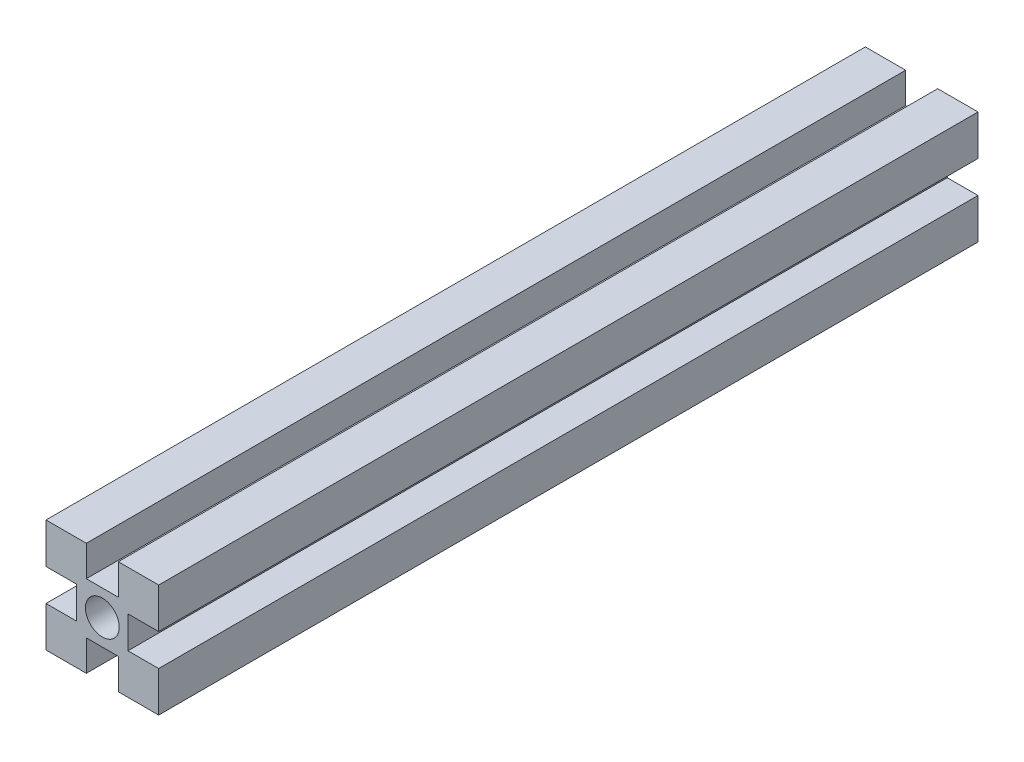
ISO-10303-21;
HEADER;
FILE_DESCRIPTION(('STEP AP214'),'2;1');
FILE_NAME('part.step','',(''),(''),'','','');
FILE_SCHEMA(('AUTOMOTIVE_DESIGN { 1 0 10303 214 1 1 1 1 }'));
ENDSEC;
DATA;
#1=APPLICATION_CONTEXT('core data for automotive mechanical design processes');
#2=APPLICATION_PROTOCOL_DEFINITION('international standard','automotive_design',2000,#1);
#3=PRODUCT_CONTEXT('',#1,'mechanical');
#4=PRODUCT('Part','Part','',(#3));
#5=PRODUCT_RELATED_PRODUCT_CATEGORY('part','',(#4));
#6=PRODUCT_DEFINITION_FORMATION('','',#4);
#7=PRODUCT_DEFINITION_CONTEXT('part definition',#1,'design');
#8=PRODUCT_DEFINITION('design','',#6,#7);
#9=PRODUCT_DEFINITION_SHAPE('','',#8);
#10=(LENGTH_UNIT() NAMED_UNIT(*) SI_UNIT(.MILLI.,.METRE.));
#11=(NAMED_UNIT(*) PLANE_ANGLE_UNIT() SI_UNIT($,.RADIAN.));
#12=(NAMED_UNIT(*) SI_UNIT($,.STERADIAN.) SOLID_ANGLE_UNIT());
#13=UNCERTAINTY_MEASURE_WITH_UNIT(LENGTH_MEASURE(1.E-05),#10,'distance_accuracy_value','');
#14=(GEOMETRIC_REPRESENTATION_CONTEXT(3) GLOBAL_UNCERTAINTY_ASSIGNED_CONTEXT((#13)) GLOBAL_UNIT_ASSIGNED_CONTEXT((#10,
#11,#12)) REPRESENTATION_CONTEXT('',''));
#15=CARTESIAN_POINT('',(0.,0.,0.));
#16=DIRECTION('',(0.,0.,1.));
#17=DIRECTION('',(1.,0.,0.));
#18=AXIS2_PLACEMENT_3D('',#15,#16,#17);
#19=CARTESIAN_POINT('',(11.,3.125,160.));
#20=DIRECTION('',(-1.,0.,0.));
#21=DIRECTION('',(0.,-1.,0.));
#22=AXIS2_PLACEMENT_3D('',#19,#20,#21);
#23=PLANE('',#22);
#24=DIRECTION('',(0.,1.,0.));
#25=VECTOR('',#24,1.);
#26=CARTESIAN_POINT('',(11.,3.125,0.));
#27=LINE('',#26,#25);
#28=CARTESIAN_POINT('',(11.,3.125,0.));
#29=VERTEX_POINT('',#28);
#30=CARTESIAN_POINT('',(11.,11.,0.));
#31=VERTEX_POINT('',#30);
#32=EDGE_CURVE('E203',#29,#31,#27,.T.);
#33=ORIENTED_EDGE('',*,*,#32,.T.);
#34=DIRECTION('',(0.,0.,-1.));
#35=VECTOR('',#34,1.);
#36=CARTESIAN_POINT('',(11.,11.,160.));
#37=LINE('',#36,#35);
#38=CARTESIAN_POINT('',(11.,11.,160.));
#39=VERTEX_POINT('',#38);
#40=EDGE_CURVE('E11',#39,#31,#37,.T.);
#41=ORIENTED_EDGE('',*,*,#40,.F.);
#42=DIRECTION('',(0.,1.,0.));
#43=VECTOR('',#42,1.);
#44=CARTESIAN_POINT('',(11.,3.125,160.));
#45=LINE('',#44,#43);
#46=CARTESIAN_POINT('',(11.,3.125,160.));
#47=VERTEX_POINT('',#46);
#48=EDGE_CURVE('E242',#47,#39,#45,.T.);
#49=ORIENTED_EDGE('',*,*,#48,.F.);
#50=DIRECTION('',(0.,0.,-1.));
#51=VECTOR('',#50,1.);
#52=CARTESIAN_POINT('',(11.,3.125,160.));
#53=LINE('',#52,#51);
#54=EDGE_CURVE('E199',#47,#29,#53,.T.);
#55=ORIENTED_EDGE('',*,*,#54,.T.);
#56=EDGE_LOOP('',(#33,#41,#49,#55));
#57=FACE_BOUND('',#56,.T.);
#58=ADVANCED_FACE('F32',(#57),#23,.F.);
#59=CARTESIAN_POINT('',(3.125,11.,160.));
#60=DIRECTION('',(0.,-1.,0.));
#61=DIRECTION('',(0.,0.,-1.));
#62=AXIS2_PLACEMENT_3D('',#59,#60,#61);
#63=PLANE('',#62);
#64=DIRECTION('',(-1.,0.,0.));
#65=VECTOR('',#64,1.);
#66=CARTESIAN_POINT('',(3.125,11.,0.));
#67=LINE('',#66,#65);
#68=CARTESIAN_POINT('',(3.125,11.,0.));
#69=VERTEX_POINT('',#68);
#70=EDGE_CURVE('E206',#31,#69,#67,.T.);
#71=ORIENTED_EDGE('',*,*,#70,.T.);
#72=DIRECTION('',(0.,0.,-1.));
#73=VECTOR('',#72,1.);
#74=CARTESIAN_POINT('',(3.125,11.,160.));
#75=LINE('',#74,#73);
#76=CARTESIAN_POINT('',(3.125,11.,160.));
#77=VERTEX_POINT('',#76);
#78=EDGE_CURVE('E40',#77,#69,#75,.T.);
#79=ORIENTED_EDGE('',*,*,#78,.F.);
#80=DIRECTION('',(-1.,0.,0.));
#81=VECTOR('',#80,1.);
#82=CARTESIAN_POINT('',(3.125,11.,160.));
#83=LINE('',#82,#81);
#84=EDGE_CURVE('E128',#39,#77,#83,.T.);
#85=ORIENTED_EDGE('',*,*,#84,.F.);
#86=ORIENTED_EDGE('',*,*,#40,.T.);
#87=EDGE_LOOP('',(#71,#79,#85,#86));
#88=FACE_BOUND('',#87,.T.);
#89=ADVANCED_FACE('F361',(#88),#63,.F.);
#90=CARTESIAN_POINT('',(3.125,11.,160.));
#91=DIRECTION('',(1.,0.,0.));
#92=DIRECTION('',(0.,1.,0.));
#93=AXIS2_PLACEMENT_3D('',#90,#91,#92);
#94=PLANE('',#93);
#95=DIRECTION('',(0.,-1.,0.));
#96=VECTOR('',#95,1.);
#97=CARTESIAN_POINT('',(3.125,11.,0.));
#98=LINE('',#97,#96);
#99=CARTESIAN_POINT('',(3.125,5.,0.));
#100=VERTEX_POINT('',#99);
#101=EDGE_CURVE('E209',#69,#100,#98,.T.);
#102=ORIENTED_EDGE('',*,*,#101,.T.);
#103=DIRECTION('',(0.,0.,-1.));
#104=VECTOR('',#103,1.);
#105=CARTESIAN_POINT('',(3.125,5.,160.));
#106=LINE('',#105,#104);
#107=CARTESIAN_POINT('',(3.125,5.,160.));
#108=VERTEX_POINT('',#107);
#109=EDGE_CURVE('E285',#108,#100,#106,.T.);
#110=ORIENTED_EDGE('',*,*,#109,.F.);
#111=DIRECTION('',(0.,-1.,0.));
#112=VECTOR('',#111,1.);
#113=CARTESIAN_POINT('',(3.125,11.,160.));
#114=LINE('',#113,#112);
#115=EDGE_CURVE('E293',#77,#108,#114,.T.);
#116=ORIENTED_EDGE('',*,*,#115,.F.);
#117=ORIENTED_EDGE('',*,*,#78,.T.);
#118=EDGE_LOOP('',(#102,#110,#116,#117));
#119=FACE_BOUND('',#118,.T.);
#120=ADVANCED_FACE('F291',(#119),#94,.F.);
#121=CARTESIAN_POINT('',(-3.125,5.,160.));
#122=DIRECTION('',(0.,-1.,0.));
#123=DIRECTION('',(0.,0.,-1.));
#124=AXIS2_PLACEMENT_3D('',#121,#122,#123);
#125=PLANE('',#124);
#126=DIRECTION('',(-1.,0.,0.));
#127=VECTOR('',#126,1.);
#128=CARTESIAN_POINT('',(-3.125,5.,0.));
#129=LINE('',#128,#127);
#130=CARTESIAN_POINT('',(-3.125,5.,0.));
#131=VERTEX_POINT('',#130);
#132=EDGE_CURVE('E211',#100,#131,#129,.T.);
#133=ORIENTED_EDGE('',*,*,#132,.T.);
#134=DIRECTION('',(0.,0.,-1.));
#135=VECTOR('',#134,1.);
#136=CARTESIAN_POINT('',(-3.125,5.,160.));
#137=LINE('',#136,#135);
#138=CARTESIAN_POINT('',(-3.125,5.,160.));
#139=VERTEX_POINT('',#138);
#140=EDGE_CURVE('E282',#139,#131,#137,.T.);
#141=ORIENTED_EDGE('',*,*,#140,.F.);
#142=DIRECTION('',(-1.,0.,0.));
#143=VECTOR('',#142,1.);
#144=CARTESIAN_POINT('',(-3.125,5.,160.));
#145=LINE('',#144,#143);
#146=EDGE_CURVE('E311',#108,#139,#145,.T.);
#147=ORIENTED_EDGE('',*,*,#146,.F.);
#148=ORIENTED_EDGE('',*,*,#109,.T.);
#149=EDGE_LOOP('',(#133,#141,#147,#148));
#150=FACE_BOUND('',#149,.T.);
#151=ADVANCED_FACE('F302',(#150),#125,.F.);
#152=CARTESIAN_POINT('',(-3.12500000000001,11.,160.));
#153=DIRECTION('',(-1.,0.,0.));
#154=DIRECTION('',(0.,-1.,0.));
#155=AXIS2_PLACEMENT_3D('',#152,#153,#154);
#156=PLANE('',#155);
#157=DIRECTION('',(0.,1.,0.));
#158=VECTOR('',#157,1.);
#159=CARTESIAN_POINT('',(-3.12500000000001,11.,0.));
#160=LINE('',#159,#158);
#161=CARTESIAN_POINT('',(-3.12500000000001,11.,0.));
#162=VERTEX_POINT('',#161);
#163=EDGE_CURVE('E213',#131,#162,#160,.T.);
#164=ORIENTED_EDGE('',*,*,#163,.T.);
#165=DIRECTION('',(0.,0.,-1.));
#166=VECTOR('',#165,1.);
#167=CARTESIAN_POINT('',(-3.12500000000001,11.,160.));
#168=LINE('',#167,#166);
#169=CARTESIAN_POINT('',(-3.12500000000001,11.,160.));
#170=VERTEX_POINT('',#169);
#171=EDGE_CURVE('E279',#170,#162,#168,.T.);
#172=ORIENTED_EDGE('',*,*,#171,.F.);
#173=DIRECTION('',(0.,1.,0.));
#174=VECTOR('',#173,1.);
#175=CARTESIAN_POINT('',(-3.12500000000001,11.,160.));
#176=LINE('',#175,#174);
#177=EDGE_CURVE('E308',#139,#170,#176,.T.);
#178=ORIENTED_EDGE('',*,*,#177,.F.);
#179=ORIENTED_EDGE('',*,*,#140,.T.);
#180=EDGE_LOOP('',(#164,#172,#178,#179));
#181=FACE_BOUND('',#180,.T.);
#182=ADVANCED_FACE('F306',(#181),#156,.F.);
#183=CARTESIAN_POINT('',(-11.,11.,160.));
#184=DIRECTION('',(0.,-1.,0.));
#185=DIRECTION('',(0.,0.,-1.));
#186=AXIS2_PLACEMENT_3D('',#183,#184,#185);
#187=PLANE('',#186);
#188=DIRECTION('',(-1.,0.,0.));
#189=VECTOR('',#188,1.);
#190=CARTESIAN_POINT('',(-11.,11.,0.));
#191=LINE('',#190,#189);
#192=CARTESIAN_POINT('',(-11.,11.,0.));
#193=VERTEX_POINT('',#192);
#194=EDGE_CURVE('E215',#162,#193,#191,.T.);
#195=ORIENTED_EDGE('',*,*,#194,.T.);
#196=DIRECTION('',(0.,0.,-1.));
#197=VECTOR('',#196,1.);
#198=CARTESIAN_POINT('',(-11.,11.,160.));
#199=LINE('',#198,#197);
#200=CARTESIAN_POINT('',(-11.,11.,160.));
#201=VERTEX_POINT('',#200);
#202=EDGE_CURVE('E276',#201,#193,#199,.T.);
#203=ORIENTED_EDGE('',*,*,#202,.F.);
#204=DIRECTION('',(-1.,0.,0.));
#205=VECTOR('',#204,1.);
#206=CARTESIAN_POINT('',(-11.,11.,160.));
#207=LINE('',#206,#205);
#208=EDGE_CURVE('E310',#170,#201,#207,.T.);
#209=ORIENTED_EDGE('',*,*,#208,.F.);
#210=ORIENTED_EDGE('',*,*,#171,.T.);
#211=EDGE_LOOP('',(#195,#203,#209,#210));
#212=FACE_BOUND('',#211,.T.);
#213=ADVANCED_FACE('F374',(#212),#187,.F.);
#214=CARTESIAN_POINT('',(-11.,3.125,160.));
#215=DIRECTION('',(1.,0.,0.));
#216=DIRECTION('',(0.,1.,0.));
#217=AXIS2_PLACEMENT_3D('',#214,#215,#216);
#218=PLANE('',#217);
#219=DIRECTION('',(0.,-1.,0.));
#220=VECTOR('',#219,1.);
#221=CARTESIAN_POINT('',(-11.,3.125,0.));
#222=LINE('',#221,#220);
#223=CARTESIAN_POINT('',(-11.,3.125,0.));
#224=VERTEX_POINT('',#223);
#225=EDGE_CURVE('E217',#193,#224,#222,.T.);
#226=ORIENTED_EDGE('',*,*,#225,.T.);
#227=DIRECTION('',(0.,0.,-1.));
#228=VECTOR('',#227,1.);
#229=CARTESIAN_POINT('',(-11.,3.125,160.));
#230=LINE('',#229,#228);
#231=CARTESIAN_POINT('',(-11.,3.125,160.));
#232=VERTEX_POINT('',#231);
#233=EDGE_CURVE('E273',#232,#224,#230,.T.);
#234=ORIENTED_EDGE('',*,*,#233,.F.);
#235=DIRECTION('',(0.,-1.,0.));
#236=VECTOR('',#235,1.);
#237=CARTESIAN_POINT('',(-11.,3.125,160.));
#238=LINE('',#237,#236);
#239=EDGE_CURVE('E313',#201,#232,#238,.T.);
#240=ORIENTED_EDGE('',*,*,#239,.F.);
#241=ORIENTED_EDGE('',*,*,#202,.T.);
#242=EDGE_LOOP('',(#226,#234,#240,#241));
#243=FACE_BOUND('',#242,.T.);
#244=ADVANCED_FACE('F377',(#243),#218,.F.);
#245=CARTESIAN_POINT('',(-11.,3.125,160.));
#246=DIRECTION('',(0.,1.,0.));
#247=DIRECTION('',(-1.,0.,0.));
#248=AXIS2_PLACEMENT_3D('',#245,#246,#247);
#249=PLANE('',#248);
#250=DIRECTION('',(1.,0.,0.));
#251=VECTOR('',#250,1.);
#252=CARTESIAN_POINT('',(-11.,3.125,0.));
#253=LINE('',#252,#251);
#254=CARTESIAN_POINT('',(-5.,3.125,0.));
#255=VERTEX_POINT('',#254);
#256=EDGE_CURVE('E219',#224,#255,#253,.T.);
#257=ORIENTED_EDGE('',*,*,#256,.T.);
#258=DIRECTION('',(0.,0.,-1.));
#259=VECTOR('',#258,1.);
#260=CARTESIAN_POINT('',(-5.,3.125,160.));
#261=LINE('',#260,#259);
#262=CARTESIAN_POINT('',(-5.,3.125,160.));
#263=VERTEX_POINT('',#262);
#264=EDGE_CURVE('E270',#263,#255,#261,.T.);
#265=ORIENTED_EDGE('',*,*,#264,.F.);
#266=DIRECTION('',(1.,0.,0.));
#267=VECTOR('',#266,1.);
#268=CARTESIAN_POINT('',(-11.,3.125,160.));
#269=LINE('',#268,#267);
#270=EDGE_CURVE('E319',#232,#263,#269,.T.);
#271=ORIENTED_EDGE('',*,*,#270,.F.);
#272=ORIENTED_EDGE('',*,*,#233,.T.);
#273=EDGE_LOOP('',(#257,#265,#271,#272));
#274=FACE_BOUND('',#273,.T.);
#275=ADVANCED_FACE('F381',(#274),#249,.F.);
#276=CARTESIAN_POINT('',(-5.,3.125,160.));
#277=DIRECTION('',(1.,0.,0.));
#278=DIRECTION('',(0.,0.,-1.));
#279=AXIS2_PLACEMENT_3D('',#276,#277,#278);
#280=PLANE('',#279);
#281=DIRECTION('',(0.,-1.,0.));
#282=VECTOR('',#281,1.);
#283=CARTESIAN_POINT('',(-5.,3.125,0.));
#284=LINE('',#283,#282);
#285=CARTESIAN_POINT('',(-5.,-3.125,0.));
#286=VERTEX_POINT('',#285);
#287=EDGE_CURVE('E221',#255,#286,#284,.T.);
#288=ORIENTED_EDGE('',*,*,#287,.T.);
#289=DIRECTION('',(0.,0.,-1.));
#290=VECTOR('',#289,1.);
#291=CARTESIAN_POINT('',(-5.,-3.125,160.));
#292=LINE('',#291,#290);
#293=CARTESIAN_POINT('',(-5.,-3.125,160.));
#294=VERTEX_POINT('',#293);
#295=EDGE_CURVE('E267',#294,#286,#292,.T.);
#296=ORIENTED_EDGE('',*,*,#295,.F.);
#297=DIRECTION('',(0.,-1.,0.));
#298=VECTOR('',#297,1.);
#299=CARTESIAN_POINT('',(-5.,3.125,160.));
#300=LINE('',#299,#298);
#301=EDGE_CURVE('E321',#263,#294,#300,.T.);
#302=ORIENTED_EDGE('',*,*,#301,.F.);
#303=ORIENTED_EDGE('',*,*,#264,.T.);
#304=EDGE_LOOP('',(#288,#296,#302,#303));
#305=FACE_BOUND('',#304,.T.);
#306=ADVANCED_FACE('F385',(#305),#280,.F.);
#307=CARTESIAN_POINT('',(-11.,-3.125,160.));
#308=DIRECTION('',(0.,-1.,0.));
#309=DIRECTION('',(0.,0.,-1.));
#310=AXIS2_PLACEMENT_3D('',#307,#308,#309);
#311=PLANE('',#310);
#312=DIRECTION('',(-1.,0.,0.));
#313=VECTOR('',#312,1.);
#314=CARTESIAN_POINT('',(-11.,-3.125,0.));
#315=LINE('',#314,#313);
#316=CARTESIAN_POINT('',(-11.,-3.125,0.));
#317=VERTEX_POINT('',#316);
#318=EDGE_CURVE('E223',#286,#317,#315,.T.);
#319=ORIENTED_EDGE('',*,*,#318,.T.);
#320=DIRECTION('',(0.,0.,-1.));
#321=VECTOR('',#320,1.);
#322=CARTESIAN_POINT('',(-11.,-3.125,160.));
#323=LINE('',#322,#321);
#324=CARTESIAN_POINT('',(-11.,-3.125,160.));
#325=VERTEX_POINT('',#324);
#326=EDGE_CURVE('E264',#325,#317,#323,.T.);
#327=ORIENTED_EDGE('',*,*,#326,.F.);
#328=DIRECTION('',(-1.,0.,0.));
#329=VECTOR('',#328,1.);
#330=CARTESIAN_POINT('',(-11.,-3.125,160.));
#331=LINE('',#330,#329);
#332=EDGE_CURVE('E323',#294,#325,#331,.T.);
#333=ORIENTED_EDGE('',*,*,#332,.F.);
#334=ORIENTED_EDGE('',*,*,#295,.T.);
#335=EDGE_LOOP('',(#319,#327,#333,#334));
#336=FACE_BOUND('',#335,.T.);
#337=ADVANCED_FACE('F389',(#336),#311,.F.);
#338=CARTESIAN_POINT('',(-11.,-11.,160.));
#339=DIRECTION('',(1.,0.,0.));
#340=DIRECTION('',(0.,1.,0.));
#341=AXIS2_PLACEMENT_3D('',#338,#339,#340);
#342=PLANE('',#341);
#343=DIRECTION('',(0.,-1.,0.));
#344=VECTOR('',#343,1.);
#345=CARTESIAN_POINT('',(-11.,-11.,0.));
#346=LINE('',#345,#344);
#347=CARTESIAN_POINT('',(-11.,-11.,0.));
#348=VERTEX_POINT('',#347);
#349=EDGE_CURVE('E225',#317,#348,#346,.T.);
#350=ORIENTED_EDGE('',*,*,#349,.T.);
#351=DIRECTION('',(0.,0.,-1.));
#352=VECTOR('',#351,1.);
#353=CARTESIAN_POINT('',(-11.,-11.,160.));
#354=LINE('',#353,#352);
#355=CARTESIAN_POINT('',(-11.,-11.,160.));
#356=VERTEX_POINT('',#355);
#357=EDGE_CURVE('E261',#356,#348,#354,.T.);
#358=ORIENTED_EDGE('',*,*,#357,.F.);
#359=DIRECTION('',(0.,-1.,0.));
#360=VECTOR('',#359,1.);
#361=CARTESIAN_POINT('',(-11.,-11.,160.));
#362=LINE('',#361,#360);
#363=EDGE_CURVE('E325',#325,#356,#362,.T.);
#364=ORIENTED_EDGE('',*,*,#363,.F.);
#365=ORIENTED_EDGE('',*,*,#326,.T.);
#366=EDGE_LOOP('',(#350,#358,#364,#365));
#367=FACE_BOUND('',#366,.T.);
#368=ADVANCED_FACE('F393',(#367),#342,.F.);
#369=CARTESIAN_POINT('',(-11.,-11.,160.));
#370=DIRECTION('',(0.,1.,0.));
#371=DIRECTION('',(-1.,0.,0.));
#372=AXIS2_PLACEMENT_3D('',#369,#370,#371);
#373=PLANE('',#372);
#374=DIRECTION('',(1.,0.,0.));
#375=VECTOR('',#374,1.);
#376=CARTESIAN_POINT('',(-11.,-11.,0.));
#377=LINE('',#376,#375);
#378=CARTESIAN_POINT('',(-3.12500000000001,-11.,0.));
#379=VERTEX_POINT('',#378);
#380=EDGE_CURVE('E227',#348,#379,#377,.T.);
#381=ORIENTED_EDGE('',*,*,#380,.T.);
#382=DIRECTION('',(0.,0.,-1.));
#383=VECTOR('',#382,1.);
#384=CARTESIAN_POINT('',(-3.12500000000001,-11.,160.));
#385=LINE('',#384,#383);
#386=CARTESIAN_POINT('',(-3.12500000000001,-11.,160.));
#387=VERTEX_POINT('',#386);
#388=EDGE_CURVE('E258',#387,#379,#385,.T.);
#389=ORIENTED_EDGE('',*,*,#388,.F.);
#390=DIRECTION('',(1.,0.,0.));
#391=VECTOR('',#390,1.);
#392=CARTESIAN_POINT('',(-11.,-11.,160.));
#393=LINE('',#392,#391);
#394=EDGE_CURVE('E327',#356,#387,#393,.T.);
#395=ORIENTED_EDGE('',*,*,#394,.F.);
#396=ORIENTED_EDGE('',*,*,#357,.T.);
#397=EDGE_LOOP('',(#381,#389,#395,#396));
#398=FACE_BOUND('',#397,.T.);
#399=ADVANCED_FACE('F397',(#398),#373,.F.);
#400=CARTESIAN_POINT('',(-3.12500000000001,-11.,160.));
#401=DIRECTION('',(-1.,0.,0.));
#402=DIRECTION('',(0.,-1.,0.));
#403=AXIS2_PLACEMENT_3D('',#400,#401,#402);
#404=PLANE('',#403);
#405=DIRECTION('',(0.,1.,0.));
#406=VECTOR('',#405,1.);
#407=CARTESIAN_POINT('',(-3.12500000000001,-11.,0.));
#408=LINE('',#407,#406);
#409=CARTESIAN_POINT('',(-3.125,-5.,0.));
#410=VERTEX_POINT('',#409);
#411=EDGE_CURVE('E229',#379,#410,#408,.T.);
#412=ORIENTED_EDGE('',*,*,#411,.T.);
#413=DIRECTION('',(0.,0.,-1.));
#414=VECTOR('',#413,1.);
#415=CARTESIAN_POINT('',(-3.125,-5.,160.));
#416=LINE('',#415,#414);
#417=CARTESIAN_POINT('',(-3.125,-5.,160.));
#418=VERTEX_POINT('',#417);
#419=EDGE_CURVE('E255',#418,#410,#416,.T.);
#420=ORIENTED_EDGE('',*,*,#419,.F.);
#421=DIRECTION('',(0.,1.,0.));
#422=VECTOR('',#421,1.);
#423=CARTESIAN_POINT('',(-3.12500000000001,-11.,160.));
#424=LINE('',#423,#422);
#425=EDGE_CURVE('E329',#387,#418,#424,.T.);
#426=ORIENTED_EDGE('',*,*,#425,.F.);
#427=ORIENTED_EDGE('',*,*,#388,.T.);
#428=EDGE_LOOP('',(#412,#420,#426,#427));
#429=FACE_BOUND('',#428,.T.);
#430=ADVANCED_FACE('F401',(#429),#404,.F.);
#431=CARTESIAN_POINT('',(-3.125,-5.,160.));
#432=DIRECTION('',(0.,1.,0.));
#433=DIRECTION('',(0.,0.,1.));
#434=AXIS2_PLACEMENT_3D('',#431,#432,#433);
#435=PLANE('',#434);
#436=DIRECTION('',(1.,0.,0.));
#437=VECTOR('',#436,1.);
#438=CARTESIAN_POINT('',(-3.125,-5.,0.));
#439=LINE('',#438,#437);
#440=CARTESIAN_POINT('',(3.125,-5.,0.));
#441=VERTEX_POINT('',#440);
#442=EDGE_CURVE('E231',#410,#441,#439,.T.);
#443=ORIENTED_EDGE('',*,*,#442,.T.);
#444=DIRECTION('',(0.,0.,-1.));
#445=VECTOR('',#444,1.);
#446=CARTESIAN_POINT('',(3.125,-5.,160.));
#447=LINE('',#446,#445);
#448=CARTESIAN_POINT('',(3.125,-5.,160.));
#449=VERTEX_POINT('',#448);
#450=EDGE_CURVE('E252',#449,#441,#447,.T.);
#451=ORIENTED_EDGE('',*,*,#450,.F.);
#452=DIRECTION('',(1.,0.,0.));
#453=VECTOR('',#452,1.);
#454=CARTESIAN_POINT('',(-3.125,-5.,160.));
#455=LINE('',#454,#453);
#456=EDGE_CURVE('E331',#418,#449,#455,.T.);
#457=ORIENTED_EDGE('',*,*,#456,.F.);
#458=ORIENTED_EDGE('',*,*,#419,.T.);
#459=EDGE_LOOP('',(#443,#451,#457,#458));
#460=FACE_BOUND('',#459,.T.);
#461=ADVANCED_FACE('F405',(#460),#435,.F.);
#462=CARTESIAN_POINT('',(3.12500000000001,-11.,160.));
#463=DIRECTION('',(1.,0.,0.));
#464=DIRECTION('',(0.,1.,0.));
#465=AXIS2_PLACEMENT_3D('',#462,#463,#464);
#466=PLANE('',#465);
#467=DIRECTION('',(0.,-1.,0.));
#468=VECTOR('',#467,1.);
#469=CARTESIAN_POINT('',(3.12500000000001,-11.,0.));
#470=LINE('',#469,#468);
#471=CARTESIAN_POINT('',(3.12500000000001,-11.,0.));
#472=VERTEX_POINT('',#471);
#473=EDGE_CURVE('E233',#441,#472,#470,.T.);
#474=ORIENTED_EDGE('',*,*,#473,.T.);
#475=DIRECTION('',(0.,0.,-1.));
#476=VECTOR('',#475,1.);
#477=CARTESIAN_POINT('',(3.12500000000001,-11.,160.));
#478=LINE('',#477,#476);
#479=CARTESIAN_POINT('',(3.12500000000001,-11.,160.));
#480=VERTEX_POINT('',#479);
#481=EDGE_CURVE('E249',#480,#472,#478,.T.);
#482=ORIENTED_EDGE('',*,*,#481,.F.);
#483=DIRECTION('',(0.,-1.,0.));
#484=VECTOR('',#483,1.);
#485=CARTESIAN_POINT('',(3.12500000000001,-11.,160.));
#486=LINE('',#485,#484);
#487=EDGE_CURVE('E333',#449,#480,#486,.T.);
#488=ORIENTED_EDGE('',*,*,#487,.F.);
#489=ORIENTED_EDGE('',*,*,#450,.T.);
#490=EDGE_LOOP('',(#474,#482,#488,#489));
#491=FACE_BOUND('',#490,.T.);
#492=ADVANCED_FACE('F409',(#491),#466,.F.);
#493=CARTESIAN_POINT('',(3.12500000000001,-11.,160.));
#494=DIRECTION('',(0.,1.,0.));
#495=DIRECTION('',(-1.,0.,0.));
#496=AXIS2_PLACEMENT_3D('',#493,#494,#495);
#497=PLANE('',#496);
#498=DIRECTION('',(1.,0.,0.));
#499=VECTOR('',#498,1.);
#500=CARTESIAN_POINT('',(3.12500000000001,-11.,0.));
#501=LINE('',#500,#499);
#502=CARTESIAN_POINT('',(11.,-11.,0.));
#503=VERTEX_POINT('',#502);
#504=EDGE_CURVE('E235',#472,#503,#501,.T.);
#505=ORIENTED_EDGE('',*,*,#504,.T.);
#506=DIRECTION('',(0.,0.,-1.));
#507=VECTOR('',#506,1.);
#508=CARTESIAN_POINT('',(11.,-11.,160.));
#509=LINE('',#508,#507);
#510=CARTESIAN_POINT('',(11.,-11.,160.));
#511=VERTEX_POINT('',#510);
#512=EDGE_CURVE('E246',#511,#503,#509,.T.);
#513=ORIENTED_EDGE('',*,*,#512,.F.);
#514=DIRECTION('',(1.,0.,0.));
#515=VECTOR('',#514,1.);
#516=CARTESIAN_POINT('',(3.12500000000001,-11.,160.));
#517=LINE('',#516,#515);
#518=EDGE_CURVE('E335',#480,#511,#517,.T.);
#519=ORIENTED_EDGE('',*,*,#518,.F.);
#520=ORIENTED_EDGE('',*,*,#481,.T.);
#521=EDGE_LOOP('',(#505,#513,#519,#520));
#522=FACE_BOUND('',#521,.T.);
#523=ADVANCED_FACE('F341',(#522),#497,.F.);
#524=CARTESIAN_POINT('',(11.,-11.,160.));
#525=DIRECTION('',(-1.,0.,0.));
#526=DIRECTION('',(0.,-1.,0.));
#527=AXIS2_PLACEMENT_3D('',#524,#525,#526);
#528=PLANE('',#527);
#529=DIRECTION('',(0.,1.,0.));
#530=VECTOR('',#529,1.);
#531=CARTESIAN_POINT('',(11.,-11.,0.));
#532=LINE('',#531,#530);
#533=CARTESIAN_POINT('',(11.,-3.12499999999999,0.));
#534=VERTEX_POINT('',#533);
#535=EDGE_CURVE('E237',#503,#534,#532,.T.);
#536=ORIENTED_EDGE('',*,*,#535,.T.);
#537=DIRECTION('',(0.,0.,-1.));
#538=VECTOR('',#537,1.);
#539=CARTESIAN_POINT('',(11.,-3.12499999999999,160.));
#540=LINE('',#539,#538);
#541=CARTESIAN_POINT('',(11.,-3.12499999999999,160.));
#542=VERTEX_POINT('',#541);
#543=EDGE_CURVE('E194',#542,#534,#540,.T.);
#544=ORIENTED_EDGE('',*,*,#543,.F.);
#545=DIRECTION('',(0.,1.,0.));
#546=VECTOR('',#545,1.);
#547=CARTESIAN_POINT('',(11.,-11.,160.));
#548=LINE('',#547,#546);
#549=EDGE_CURVE('E185',#511,#542,#548,.T.);
#550=ORIENTED_EDGE('',*,*,#549,.F.);
#551=ORIENTED_EDGE('',*,*,#512,.T.);
#552=EDGE_LOOP('',(#536,#544,#550,#551));
#553=FACE_BOUND('',#552,.T.);
#554=ADVANCED_FACE('F345',(#553),#528,.F.);
#555=CARTESIAN_POINT('',(11.,-3.12499999999999,160.));
#556=DIRECTION('',(0.,-1.,0.));
#557=DIRECTION('',(1.,0.,0.));
#558=AXIS2_PLACEMENT_3D('',#555,#556,#557);
#559=PLANE('',#558);
#560=DIRECTION('',(-1.,0.,0.));
#561=VECTOR('',#560,1.);
#562=CARTESIAN_POINT('',(11.,-3.12499999999999,0.));
#563=LINE('',#562,#561);
#564=CARTESIAN_POINT('',(5.,-3.125,0.));
#565=VERTEX_POINT('',#564);
#566=EDGE_CURVE('E193',#534,#565,#563,.T.);
#567=ORIENTED_EDGE('',*,*,#566,.T.);
#568=DIRECTION('',(0.,0.,-1.));
#569=VECTOR('',#568,1.);
#570=CARTESIAN_POINT('',(5.,-3.125,160.));
#571=LINE('',#570,#569);
#572=CARTESIAN_POINT('',(5.,-3.125,160.));
#573=VERTEX_POINT('',#572);
#574=EDGE_CURVE('E190',#573,#565,#571,.T.);
#575=ORIENTED_EDGE('',*,*,#574,.F.);
#576=DIRECTION('',(-1.,0.,0.));
#577=VECTOR('',#576,1.);
#578=CARTESIAN_POINT('',(11.,-3.12499999999999,160.));
#579=LINE('',#578,#577);
#580=EDGE_CURVE('E179',#542,#573,#579,.T.);
#581=ORIENTED_EDGE('',*,*,#580,.F.);
#582=ORIENTED_EDGE('',*,*,#543,.T.);
#583=EDGE_LOOP('',(#567,#575,#581,#582));
#584=FACE_BOUND('',#583,.T.);
#585=ADVANCED_FACE('F191',(#584),#559,.F.);
#586=CARTESIAN_POINT('',(5.,3.125,160.));
#587=DIRECTION('',(-1.,0.,0.));
#588=DIRECTION('',(0.,0.,1.));
#589=AXIS2_PLACEMENT_3D('',#586,#587,#588);
#590=PLANE('',#589);
#591=DIRECTION('',(0.,1.,0.));
#592=VECTOR('',#591,1.);
#593=CARTESIAN_POINT('',(5.,3.125,0.));
#594=LINE('',#593,#592);
#595=CARTESIAN_POINT('',(5.,3.125,0.));
#596=VERTEX_POINT('',#595);
#597=EDGE_CURVE('E114',#565,#596,#594,.T.);
#598=ORIENTED_EDGE('',*,*,#597,.T.);
#599=DIRECTION('',(0.,0.,-1.));
#600=VECTOR('',#599,1.);
#601=CARTESIAN_POINT('',(5.,3.125,160.));
#602=LINE('',#601,#600);
#603=CARTESIAN_POINT('',(5.,3.125,160.));
#604=VERTEX_POINT('',#603);
#605=EDGE_CURVE('E195',#604,#596,#602,.T.);
#606=ORIENTED_EDGE('',*,*,#605,.F.);
#607=DIRECTION('',(0.,1.,0.));
#608=VECTOR('',#607,1.);
#609=CARTESIAN_POINT('',(5.,3.125,160.));
#610=LINE('',#609,#608);
#611=EDGE_CURVE('E183',#573,#604,#610,.T.);
#612=ORIENTED_EDGE('',*,*,#611,.F.);
#613=ORIENTED_EDGE('',*,*,#574,.T.);
#614=EDGE_LOOP('',(#598,#606,#612,#613));
#615=FACE_BOUND('',#614,.T.);
#616=ADVANCED_FACE('F197',(#615),#590,.F.);
#617=CARTESIAN_POINT('',(11.,3.125,160.));
#618=DIRECTION('',(0.,1.,0.));
#619=DIRECTION('',(-1.,0.,0.));
#620=AXIS2_PLACEMENT_3D('',#617,#618,#619);
#621=PLANE('',#620);
#622=DIRECTION('',(1.,0.,0.));
#623=VECTOR('',#622,1.);
#624=CARTESIAN_POINT('',(11.,3.125,0.));
#625=LINE('',#624,#623);
#626=EDGE_CURVE('E120',#596,#29,#625,.T.);
#627=ORIENTED_EDGE('',*,*,#626,.T.);
#628=ORIENTED_EDGE('',*,*,#54,.F.);
#629=DIRECTION('',(1.,0.,0.));
#630=VECTOR('',#629,1.);
#631=CARTESIAN_POINT('',(11.,3.125,160.));
#632=LINE('',#631,#630);
#633=EDGE_CURVE('E48',#604,#47,#632,.T.);
#634=ORIENTED_EDGE('',*,*,#633,.F.);
#635=ORIENTED_EDGE('',*,*,#605,.T.);
#636=EDGE_LOOP('',(#627,#628,#634,#635));
#637=FACE_BOUND('',#636,.T.);
#638=ADVANCED_FACE('F349',(#637),#621,.F.);
#639=CARTESIAN_POINT('',(0.,0.,160.));
#640=DIRECTION('',(0.,0.,-1.));
#641=DIRECTION('',(-1.,0.,0.));
#642=AXIS2_PLACEMENT_3D('',#639,#640,#641);
#643=PLANE('',#642);
#644=CARTESIAN_POINT('',(0.,0.,160.));
#645=DIRECTION('',(0.,0.,1.));
#646=DIRECTION('',(1.,0.,0.));
#647=AXIS2_PLACEMENT_3D('',#644,#645,#646);
#648=CIRCLE('',#647,3.29999999999999);
#649=CARTESIAN_POINT('',(3.29999999999999,0.,160.));
#650=VERTEX_POINT('',#649);
#651=EDGE_CURVE('E497',#650,#650,#648,.T.);
#652=ORIENTED_EDGE('',*,*,#651,.F.);
#653=EDGE_LOOP('',(#652));
#654=FACE_BOUND('',#653,.T.);
#655=ORIENTED_EDGE('',*,*,#48,.T.);
#656=ORIENTED_EDGE('',*,*,#84,.T.);
#657=ORIENTED_EDGE('',*,*,#115,.T.);
#658=ORIENTED_EDGE('',*,*,#146,.T.);
#659=ORIENTED_EDGE('',*,*,#177,.T.);
#660=ORIENTED_EDGE('',*,*,#208,.T.);
#661=ORIENTED_EDGE('',*,*,#239,.T.);
#662=ORIENTED_EDGE('',*,*,#270,.T.);
#663=ORIENTED_EDGE('',*,*,#301,.T.);
#664=ORIENTED_EDGE('',*,*,#332,.T.);
#665=ORIENTED_EDGE('',*,*,#363,.T.);
#666=ORIENTED_EDGE('',*,*,#394,.T.);
#667=ORIENTED_EDGE('',*,*,#425,.T.);
#668=ORIENTED_EDGE('',*,*,#456,.T.);
#669=ORIENTED_EDGE('',*,*,#487,.T.);
#670=ORIENTED_EDGE('',*,*,#518,.T.);
#671=ORIENTED_EDGE('',*,*,#549,.T.);
#672=ORIENTED_EDGE('',*,*,#580,.T.);
#673=ORIENTED_EDGE('',*,*,#611,.T.);
#674=ORIENTED_EDGE('',*,*,#633,.T.);
#675=EDGE_LOOP('',(#655,#656,#657,#658,#659,#660,#661,#662,#663,#664,#665,#666,#667,#668,#669,
#670,#671,#672,#673,#674));
#676=FACE_BOUND('',#675,.T.);
#677=ADVANCED_FACE('F181',(#654,#676),#643,.F.);
#678=CARTESIAN_POINT('',(0.,0.,0.));
#679=DIRECTION('',(0.,0.,-1.));
#680=DIRECTION('',(-1.,0.,0.));
#681=AXIS2_PLACEMENT_3D('',#678,#679,#680);
#682=PLANE('',#681);
#683=CARTESIAN_POINT('',(0.,0.,0.));
#684=DIRECTION('',(0.,0.,-1.));
#685=DIRECTION('',(-1.,0.,0.));
#686=AXIS2_PLACEMENT_3D('',#683,#684,#685);
#687=CIRCLE('',#686,3.29999999999999);
#688=CARTESIAN_POINT('',(-3.29999999999999,0.,0.));
#689=VERTEX_POINT('',#688);
#690=EDGE_CURVE('E495',#689,#689,#687,.T.);
#691=ORIENTED_EDGE('',*,*,#690,.F.);
#692=EDGE_LOOP('',(#691));
#693=FACE_BOUND('',#692,.T.);
#694=ORIENTED_EDGE('',*,*,#32,.F.);
#695=ORIENTED_EDGE('',*,*,#626,.F.);
#696=ORIENTED_EDGE('',*,*,#597,.F.);
#697=ORIENTED_EDGE('',*,*,#566,.F.);
#698=ORIENTED_EDGE('',*,*,#535,.F.);
#699=ORIENTED_EDGE('',*,*,#504,.F.);
#700=ORIENTED_EDGE('',*,*,#473,.F.);
#701=ORIENTED_EDGE('',*,*,#442,.F.);
#702=ORIENTED_EDGE('',*,*,#411,.F.);
#703=ORIENTED_EDGE('',*,*,#380,.F.);
#704=ORIENTED_EDGE('',*,*,#349,.F.);
#705=ORIENTED_EDGE('',*,*,#318,.F.);
#706=ORIENTED_EDGE('',*,*,#287,.F.);
#707=ORIENTED_EDGE('',*,*,#256,.F.);
#708=ORIENTED_EDGE('',*,*,#225,.F.);
#709=ORIENTED_EDGE('',*,*,#194,.F.);
#710=ORIENTED_EDGE('',*,*,#163,.F.);
#711=ORIENTED_EDGE('',*,*,#132,.F.);
#712=ORIENTED_EDGE('',*,*,#101,.F.);
#713=ORIENTED_EDGE('',*,*,#70,.F.);
#714=EDGE_LOOP('',(#694,#695,#696,#697,#698,#699,#700,#701,#702,#703,#704,#705,#706,#707,#708,
#709,#710,#711,#712,#713));
#715=FACE_BOUND('',#714,.T.);
#716=ADVANCED_FACE('F297',(#693,#715),#682,.T.);
#717=CARTESIAN_POINT('',(0.,0.,136.982840042791));
#718=DIRECTION('',(0.,0.,1.));
#719=DIRECTION('',(1.,0.,0.));
#720=AXIS2_PLACEMENT_3D('',#717,#718,#719);
#721=CONICAL_SURFACE('',#720,3.3,1.02974425867665);
#722=CARTESIAN_POINT('',(0.,0.,135.));
#723=VERTEX_POINT('',#722);
#724=VERTEX_LOOP('',#723);
#725=FACE_BOUND('',#724,.T.);
#726=CARTESIAN_POINT('',(0.,0.,136.982840042791));
#727=DIRECTION('',(0.,0.,1.));
#728=DIRECTION('',(1.,0.,0.));
#729=AXIS2_PLACEMENT_3D('',#726,#727,#728);
#730=CIRCLE('',#729,3.3);
#731=CARTESIAN_POINT('',(3.3,0.,136.982840042791));
#732=VERTEX_POINT('',#731);
#733=EDGE_CURVE('E207',#732,#732,#730,.T.);
#734=ORIENTED_EDGE('',*,*,#733,.T.);
#735=EDGE_LOOP('',(#734));
#736=FACE_BOUND('',#735,.T.);
#737=ADVANCED_FACE('F444',(#725,#736),#721,.F.);
#738=CARTESIAN_POINT('',(0.,0.,160.));
#739=DIRECTION('',(0.,0.,1.));
#740=DIRECTION('',(1.,0.,0.));
#741=AXIS2_PLACEMENT_3D('',#738,#739,#740);
#742=CYLINDRICAL_SURFACE('',#741,3.29999999999999);
#743=ORIENTED_EDGE('',*,*,#733,.F.);
#744=EDGE_LOOP('',(#743));
#745=FACE_BOUND('',#744,.T.);
#746=ORIENTED_EDGE('',*,*,#651,.T.);
#747=EDGE_LOOP('',(#746));
#748=FACE_BOUND('',#747,.T.);
#749=ADVANCED_FACE('F449',(#745,#748),#742,.F.);
#750=CARTESIAN_POINT('',(0.,0.,23.0171599572091));
#751=DIRECTION('',(0.,0.,-1.));
#752=DIRECTION('',(-1.,0.,0.));
#753=AXIS2_PLACEMENT_3D('',#750,#751,#752);
#754=CONICAL_SURFACE('',#753,3.3,1.02974425867665);
#755=CARTESIAN_POINT('',(0.,0.,25.));
#756=VERTEX_POINT('',#755);
#757=VERTEX_LOOP('',#756);
#758=FACE_BOUND('',#757,.T.);
#759=CARTESIAN_POINT('',(0.,0.,23.0171599572091));
#760=DIRECTION('',(0.,0.,-1.));
#761=DIRECTION('',(-1.,0.,0.));
#762=AXIS2_PLACEMENT_3D('',#759,#760,#761);
#763=CIRCLE('',#762,3.3);
#764=CARTESIAN_POINT('',(-3.3,0.,23.0171599572091));
#765=VERTEX_POINT('',#764);
#766=EDGE_CURVE('E492',#765,#765,#763,.T.);
#767=ORIENTED_EDGE('',*,*,#766,.T.);
#768=EDGE_LOOP('',(#767));
#769=FACE_BOUND('',#768,.T.);
#770=ADVANCED_FACE('F459',(#758,#769),#754,.F.);
#771=CARTESIAN_POINT('',(0.,0.,0.));
#772=DIRECTION('',(0.,0.,-1.));
#773=DIRECTION('',(-1.,0.,0.));
#774=AXIS2_PLACEMENT_3D('',#771,#772,#773);
#775=CYLINDRICAL_SURFACE('',#774,3.29999999999999);
#776=ORIENTED_EDGE('',*,*,#766,.F.);
#777=EDGE_LOOP('',(#776));
#778=FACE_BOUND('',#777,.T.);
#779=ORIENTED_EDGE('',*,*,#690,.T.);
#780=EDGE_LOOP('',(#779));
#781=FACE_BOUND('',#780,.T.);
#782=ADVANCED_FACE('F475',(#778,#781),#775,.F.);
#783=CLOSED_SHELL('',(#58,#89,#120,#151,#182,#213,#244,#275,#306,#337,#368,#399,#430,#461,#492,
#523,#554,#585,#616,#638,#677,#716,#737,#749,#770,#782));
#784=MANIFOLD_SOLID_BREP('B2',#783);
#785=ADVANCED_BREP_SHAPE_REPRESENTATION('',(#18,#784),#14);
#786=SHAPE_DEFINITION_REPRESENTATION(#9,#785);
ENDSEC;
END-ISO-10303-21;
